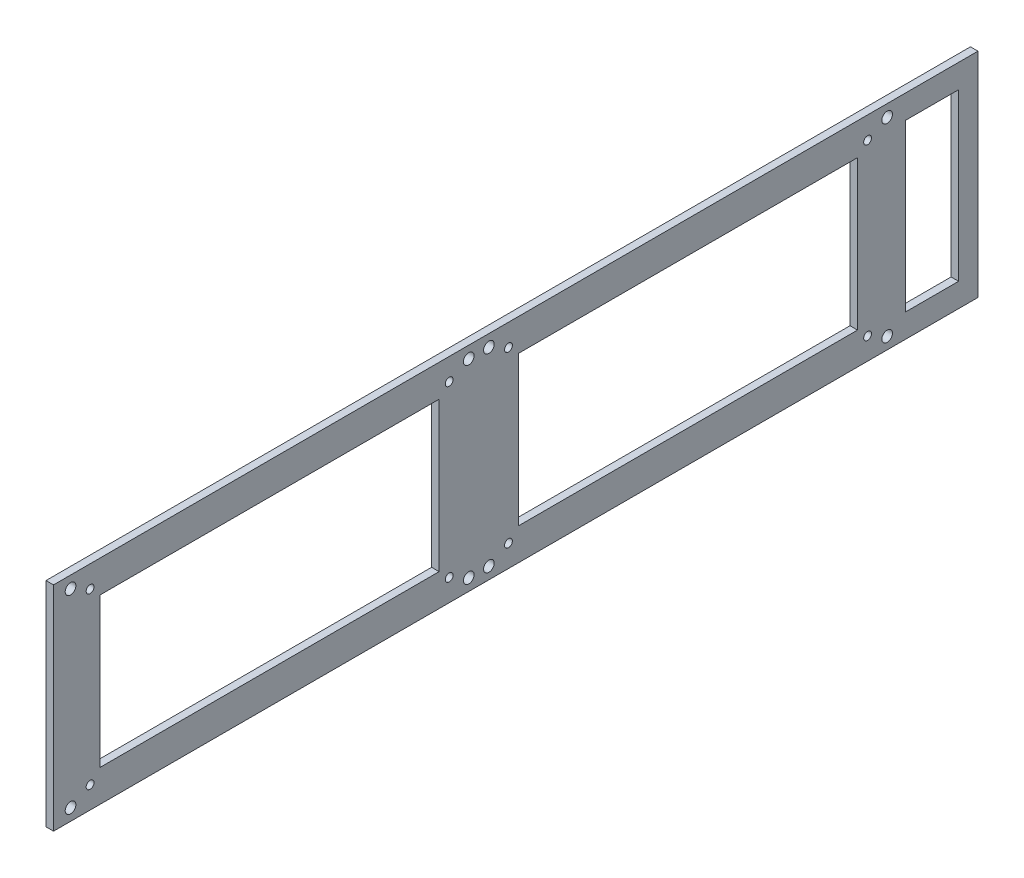
ISO-10303-21;
HEADER;
FILE_DESCRIPTION(('STEP AP214'),'2;1');
FILE_NAME('part.step','',(''),(''),'','','');
FILE_SCHEMA(('AUTOMOTIVE_DESIGN { 1 0 10303 214 1 1 1 1 }'));
ENDSEC;
DATA;
#1=APPLICATION_CONTEXT('core data for automotive mechanical design processes');
#2=APPLICATION_PROTOCOL_DEFINITION('international standard','automotive_design',2000,#1);
#3=PRODUCT_CONTEXT('',#1,'mechanical');
#4=PRODUCT('Part','Part','',(#3));
#5=PRODUCT_RELATED_PRODUCT_CATEGORY('part','',(#4));
#6=PRODUCT_DEFINITION_FORMATION('','',#4);
#7=PRODUCT_DEFINITION_CONTEXT('part definition',#1,'design');
#8=PRODUCT_DEFINITION('design','',#6,#7);
#9=PRODUCT_DEFINITION_SHAPE('','',#8);
#10=(LENGTH_UNIT() NAMED_UNIT(*) SI_UNIT(.MILLI.,.METRE.));
#11=(NAMED_UNIT(*) PLANE_ANGLE_UNIT() SI_UNIT($,.RADIAN.));
#12=(NAMED_UNIT(*) SI_UNIT($,.STERADIAN.) SOLID_ANGLE_UNIT());
#13=UNCERTAINTY_MEASURE_WITH_UNIT(LENGTH_MEASURE(1.E-05),#10,'distance_accuracy_value','');
#14=(GEOMETRIC_REPRESENTATION_CONTEXT(3) GLOBAL_UNCERTAINTY_ASSIGNED_CONTEXT((#13)) GLOBAL_UNIT_ASSIGNED_CONTEXT((#10,
#11,#12)) REPRESENTATION_CONTEXT('',''));
#15=CARTESIAN_POINT('',(0.,0.,0.));
#16=DIRECTION('',(0.,0.,1.));
#17=DIRECTION('',(1.,0.,0.));
#18=AXIS2_PLACEMENT_3D('',#15,#16,#17);
#19=CARTESIAN_POINT('',(0.,0.,0.));
#20=DIRECTION('',(-1.,0.,0.));
#21=DIRECTION('',(0.,0.,1.));
#22=AXIS2_PLACEMENT_3D('',#19,#20,#21);
#23=PLANE('',#22);
#24=CARTESIAN_POINT('',(0.,-40.,19.825));
#25=DIRECTION('',(1.,0.,0.));
#26=DIRECTION('',(0.,0.,-1.));
#27=AXIS2_PLACEMENT_3D('',#24,#25,#26);
#28=CIRCLE('',#27,2.25);
#29=CARTESIAN_POINT('',(0.,-40.,17.575));
#30=VERTEX_POINT('',#29);
#31=EDGE_CURVE('E463',#30,#30,#28,.T.);
#32=ORIENTED_EDGE('',*,*,#31,.T.);
#33=EDGE_LOOP('',(#32));
#34=FACE_BOUND('',#33,.T.);
#35=CARTESIAN_POINT('',(0.,40.,-156.675));
#36=DIRECTION('',(1.,0.,0.));
#37=DIRECTION('',(0.,0.,-1.));
#38=AXIS2_PLACEMENT_3D('',#35,#36,#37);
#39=CIRCLE('',#38,2.25);
#40=CARTESIAN_POINT('',(0.,40.,-158.925));
#41=VERTEX_POINT('',#40);
#42=EDGE_CURVE('E466',#41,#41,#39,.T.);
#43=ORIENTED_EDGE('',*,*,#42,.T.);
#44=EDGE_LOOP('',(#43));
#45=FACE_BOUND('',#44,.T.);
#46=CARTESIAN_POINT('',(0.,-40.,11.325));
#47=DIRECTION('',(1.,0.,0.));
#48=DIRECTION('',(0.,0.,-1.));
#49=AXIS2_PLACEMENT_3D('',#46,#47,#48);
#50=CIRCLE('',#49,2.25);
#51=CARTESIAN_POINT('',(0.,-40.,9.07500000000004));
#52=VERTEX_POINT('',#51);
#53=EDGE_CURVE('E470',#52,#52,#50,.T.);
#54=ORIENTED_EDGE('',*,*,#53,.T.);
#55=EDGE_LOOP('',(#54));
#56=FACE_BOUND('',#55,.T.);
#57=CARTESIAN_POINT('',(0.,40.,11.325));
#58=DIRECTION('',(1.,0.,0.));
#59=DIRECTION('',(0.,0.,-1.));
#60=AXIS2_PLACEMENT_3D('',#57,#58,#59);
#61=CIRCLE('',#60,2.25);
#62=CARTESIAN_POINT('',(0.,40.,9.07500000000004));
#63=VERTEX_POINT('',#62);
#64=EDGE_CURVE('E474',#63,#63,#61,.T.);
#65=ORIENTED_EDGE('',*,*,#64,.T.);
#66=EDGE_LOOP('',(#65));
#67=FACE_BOUND('',#66,.T.);
#68=CARTESIAN_POINT('',(0.,-40.,-156.675));
#69=DIRECTION('',(1.,0.,0.));
#70=DIRECTION('',(0.,0.,-1.));
#71=AXIS2_PLACEMENT_3D('',#68,#69,#70);
#72=CIRCLE('',#71,2.25);
#73=CARTESIAN_POINT('',(0.,-40.,-158.925));
#74=VERTEX_POINT('',#73);
#75=EDGE_CURVE('E172',#74,#74,#72,.T.);
#76=ORIENTED_EDGE('',*,*,#75,.T.);
#77=EDGE_LOOP('',(#76));
#78=FACE_BOUND('',#77,.T.);
#79=DIRECTION('',(0.,1.,0.));
#80=VECTOR('',#79,1.);
#81=CARTESIAN_POINT('',(0.,-35.,-186.825));
#82=LINE('',#81,#80);
#83=CARTESIAN_POINT('',(0.,-35.,-186.825));
#84=VERTEX_POINT('',#83);
#85=CARTESIAN_POINT('',(0.,35.,-186.825));
#86=VERTEX_POINT('',#85);
#87=EDGE_CURVE('E151',#84,#86,#82,.T.);
#88=ORIENTED_EDGE('',*,*,#87,.T.);
#89=DIRECTION('',(0.,0.,1.));
#90=VECTOR('',#89,1.);
#91=CARTESIAN_POINT('',(0.,35.,-164.35));
#92=LINE('',#91,#90);
#93=CARTESIAN_POINT('',(0.,35.,-164.35));
#94=VERTEX_POINT('',#93);
#95=EDGE_CURVE('E160',#86,#94,#92,.T.);
#96=ORIENTED_EDGE('',*,*,#95,.T.);
#97=DIRECTION('',(0.,-1.,0.));
#98=VECTOR('',#97,1.);
#99=CARTESIAN_POINT('',(0.,-35.,-164.35));
#100=LINE('',#99,#98);
#101=CARTESIAN_POINT('',(0.,-35.,-164.35));
#102=VERTEX_POINT('',#101);
#103=EDGE_CURVE('E51',#94,#102,#100,.T.);
#104=ORIENTED_EDGE('',*,*,#103,.T.);
#105=DIRECTION('',(0.,0.,-1.));
#106=VECTOR('',#105,1.);
#107=CARTESIAN_POINT('',(0.,-35.,-164.35));
#108=LINE('',#107,#106);
#109=EDGE_CURVE('E157',#102,#84,#108,.T.);
#110=ORIENTED_EDGE('',*,*,#109,.T.);
#111=EDGE_LOOP('',(#88,#96,#104,#110));
#112=FACE_BOUND('',#111,.T.);
#113=CARTESIAN_POINT('',(0.,35.75,28.0750000000001));
#114=DIRECTION('',(1.,0.,0.));
#115=DIRECTION('',(0.,0.,-1.));
#116=AXIS2_PLACEMENT_3D('',#113,#114,#115);
#117=CIRCLE('',#116,1.65);
#118=CARTESIAN_POINT('',(0.,35.75,26.4250000000001));
#119=VERTEX_POINT('',#118);
#120=EDGE_CURVE('E190',#119,#119,#117,.T.);
#121=ORIENTED_EDGE('',*,*,#120,.T.);
#122=EDGE_LOOP('',(#121));
#123=FACE_BOUND('',#122,.T.);
#124=CARTESIAN_POINT('',(0.,-35.75,179.575));
#125=DIRECTION('',(1.,0.,0.));
#126=DIRECTION('',(0.,0.,-1.));
#127=AXIS2_PLACEMENT_3D('',#124,#125,#126);
#128=CIRCLE('',#127,1.65);
#129=CARTESIAN_POINT('',(0.,-35.75,177.925));
#130=VERTEX_POINT('',#129);
#131=EDGE_CURVE('E196',#130,#130,#128,.T.);
#132=ORIENTED_EDGE('',*,*,#131,.T.);
#133=EDGE_LOOP('',(#132));
#134=FACE_BOUND('',#133,.T.);
#135=CARTESIAN_POINT('',(0.,35.75,179.575));
#136=DIRECTION('',(1.,0.,0.));
#137=DIRECTION('',(0.,0.,-1.));
#138=AXIS2_PLACEMENT_3D('',#135,#136,#137);
#139=CIRCLE('',#138,1.65);
#140=CARTESIAN_POINT('',(0.,35.75,177.925));
#141=VERTEX_POINT('',#140);
#142=EDGE_CURVE('E202',#141,#141,#139,.T.);
#143=ORIENTED_EDGE('',*,*,#142,.T.);
#144=EDGE_LOOP('',(#143));
#145=FACE_BOUND('',#144,.T.);
#146=CARTESIAN_POINT('',(0.,-35.75,28.0750000000001));
#147=DIRECTION('',(1.,0.,0.));
#148=DIRECTION('',(0.,0.,-1.));
#149=AXIS2_PLACEMENT_3D('',#146,#147,#148);
#150=CIRCLE('',#149,1.65);
#151=CARTESIAN_POINT('',(0.,-35.75,26.4250000000001));
#152=VERTEX_POINT('',#151);
#153=EDGE_CURVE('E208',#152,#152,#150,.T.);
#154=ORIENTED_EDGE('',*,*,#153,.T.);
#155=EDGE_LOOP('',(#154));
#156=FACE_BOUND('',#155,.T.);
#157=CARTESIAN_POINT('',(0.,35.75,-148.425));
#158=DIRECTION('',(1.,0.,0.));
#159=DIRECTION('',(0.,0.,-1.));
#160=AXIS2_PLACEMENT_3D('',#157,#158,#159);
#161=CIRCLE('',#160,1.65);
#162=CARTESIAN_POINT('',(0.,35.75,-150.075));
#163=VERTEX_POINT('',#162);
#164=EDGE_CURVE('E214',#163,#163,#161,.T.);
#165=ORIENTED_EDGE('',*,*,#164,.T.);
#166=EDGE_LOOP('',(#165));
#167=FACE_BOUND('',#166,.T.);
#168=CARTESIAN_POINT('',(0.,-35.75,3.07500000000004));
#169=DIRECTION('',(1.,0.,0.));
#170=DIRECTION('',(0.,0.,-1.));
#171=AXIS2_PLACEMENT_3D('',#168,#169,#170);
#172=CIRCLE('',#171,1.65);
#173=CARTESIAN_POINT('',(0.,-35.75,1.42500000000004));
#174=VERTEX_POINT('',#173);
#175=EDGE_CURVE('E220',#174,#174,#172,.T.);
#176=ORIENTED_EDGE('',*,*,#175,.T.);
#177=EDGE_LOOP('',(#176));
#178=FACE_BOUND('',#177,.T.);
#179=CARTESIAN_POINT('',(0.,35.75,3.07500000000004));
#180=DIRECTION('',(1.,0.,0.));
#181=DIRECTION('',(0.,0.,-1.));
#182=AXIS2_PLACEMENT_3D('',#179,#180,#181);
#183=CIRCLE('',#182,1.65);
#184=CARTESIAN_POINT('',(0.,35.75,1.42500000000004));
#185=VERTEX_POINT('',#184);
#186=EDGE_CURVE('E226',#185,#185,#183,.T.);
#187=ORIENTED_EDGE('',*,*,#186,.T.);
#188=EDGE_LOOP('',(#187));
#189=FACE_BOUND('',#188,.T.);
#190=DIRECTION('',(0.,1.,0.));
#191=VECTOR('',#190,1.);
#192=CARTESIAN_POINT('',(0.,-45.,-195.));
#193=LINE('',#192,#191);
#194=CARTESIAN_POINT('',(0.,-45.,-195.));
#195=VERTEX_POINT('',#194);
#196=CARTESIAN_POINT('',(0.,45.,-195.));
#197=VERTEX_POINT('',#196);
#198=EDGE_CURVE('E263',#195,#197,#193,.T.);
#199=ORIENTED_EDGE('',*,*,#198,.F.);
#200=DIRECTION('',(0.,0.,-1.));
#201=VECTOR('',#200,1.);
#202=CARTESIAN_POINT('',(0.,-45.,195.));
#203=LINE('',#202,#201);
#204=CARTESIAN_POINT('',(0.,-45.,195.));
#205=VERTEX_POINT('',#204);
#206=EDGE_CURVE('E304',#205,#195,#203,.T.);
#207=ORIENTED_EDGE('',*,*,#206,.F.);
#208=DIRECTION('',(0.,-1.,0.));
#209=VECTOR('',#208,1.);
#210=CARTESIAN_POINT('',(0.,-45.,195.));
#211=LINE('',#210,#209);
#212=CARTESIAN_POINT('',(0.,45.,195.));
#213=VERTEX_POINT('',#212);
#214=EDGE_CURVE('E315',#213,#205,#211,.T.);
#215=ORIENTED_EDGE('',*,*,#214,.F.);
#216=DIRECTION('',(0.,0.,1.));
#217=VECTOR('',#216,1.);
#218=CARTESIAN_POINT('',(0.,45.,195.));
#219=LINE('',#218,#217);
#220=EDGE_CURVE('E313',#197,#213,#219,.T.);
#221=ORIENTED_EDGE('',*,*,#220,.F.);
#222=EDGE_LOOP('',(#199,#207,#215,#221));
#223=FACE_BOUND('',#222,.T.);
#224=DIRECTION('',(0.,1.,0.));
#225=VECTOR('',#224,1.);
#226=CARTESIAN_POINT('',(0.,-31.5,-144.175));
#227=LINE('',#226,#225);
#228=CARTESIAN_POINT('',(0.,-31.5,-144.175));
#229=VERTEX_POINT('',#228);
#230=CARTESIAN_POINT('',(0.,31.5,-144.175));
#231=VERTEX_POINT('',#230);
#232=EDGE_CURVE('E270',#229,#231,#227,.T.);
#233=ORIENTED_EDGE('',*,*,#232,.T.);
#234=DIRECTION('',(0.,0.,1.));
#235=VECTOR('',#234,1.);
#236=CARTESIAN_POINT('',(0.,31.5,-1.17499999999993));
#237=LINE('',#236,#235);
#238=CARTESIAN_POINT('',(0.,31.5,-1.17499999999993));
#239=VERTEX_POINT('',#238);
#240=EDGE_CURVE('E273',#231,#239,#237,.T.);
#241=ORIENTED_EDGE('',*,*,#240,.T.);
#242=DIRECTION('',(0.,-1.,0.));
#243=VECTOR('',#242,1.);
#244=CARTESIAN_POINT('',(0.,-31.5,-1.17499999999993));
#245=LINE('',#244,#243);
#246=CARTESIAN_POINT('',(0.,-31.5,-1.17499999999993));
#247=VERTEX_POINT('',#246);
#248=EDGE_CURVE('E277',#239,#247,#245,.T.);
#249=ORIENTED_EDGE('',*,*,#248,.T.);
#250=DIRECTION('',(0.,0.,-1.));
#251=VECTOR('',#250,1.);
#252=CARTESIAN_POINT('',(0.,-31.5,-1.17499999999993));
#253=LINE('',#252,#251);
#254=EDGE_CURVE('E280',#247,#229,#253,.T.);
#255=ORIENTED_EDGE('',*,*,#254,.T.);
#256=EDGE_LOOP('',(#233,#241,#249,#255));
#257=FACE_BOUND('',#256,.T.);
#258=DIRECTION('',(0.,1.,0.));
#259=VECTOR('',#258,1.);
#260=CARTESIAN_POINT('',(0.,-31.5,32.325));
#261=LINE('',#260,#259);
#262=CARTESIAN_POINT('',(0.,-31.5,32.325));
#263=VERTEX_POINT('',#262);
#264=CARTESIAN_POINT('',(0.,31.5,32.325));
#265=VERTEX_POINT('',#264);
#266=EDGE_CURVE('E236',#263,#265,#261,.T.);
#267=ORIENTED_EDGE('',*,*,#266,.T.);
#268=DIRECTION('',(0.,0.,1.));
#269=VECTOR('',#268,1.);
#270=CARTESIAN_POINT('',(0.,31.5,175.325));
#271=LINE('',#270,#269);
#272=CARTESIAN_POINT('',(0.,31.5,175.325));
#273=VERTEX_POINT('',#272);
#274=EDGE_CURVE('E239',#265,#273,#271,.T.);
#275=ORIENTED_EDGE('',*,*,#274,.T.);
#276=DIRECTION('',(0.,-1.,0.));
#277=VECTOR('',#276,1.);
#278=CARTESIAN_POINT('',(0.,-31.5,175.325));
#279=LINE('',#278,#277);
#280=CARTESIAN_POINT('',(0.,-31.5,175.325));
#281=VERTEX_POINT('',#280);
#282=EDGE_CURVE('E243',#273,#281,#279,.T.);
#283=ORIENTED_EDGE('',*,*,#282,.T.);
#284=DIRECTION('',(0.,0.,-1.));
#285=VECTOR('',#284,1.);
#286=CARTESIAN_POINT('',(0.,-31.5,175.325));
#287=LINE('',#286,#285);
#288=EDGE_CURVE('E246',#281,#263,#287,.T.);
#289=ORIENTED_EDGE('',*,*,#288,.T.);
#290=EDGE_LOOP('',(#267,#275,#283,#289));
#291=FACE_BOUND('',#290,.T.);
#292=CARTESIAN_POINT('',(0.,-35.75,-148.425));
#293=DIRECTION('',(1.,0.,0.));
#294=DIRECTION('',(0.,0.,-1.));
#295=AXIS2_PLACEMENT_3D('',#292,#293,#294);
#296=CIRCLE('',#295,1.65);
#297=CARTESIAN_POINT('',(0.,-35.75,-150.075));
#298=VERTEX_POINT('',#297);
#299=EDGE_CURVE('E232',#298,#298,#296,.T.);
#300=ORIENTED_EDGE('',*,*,#299,.T.);
#301=EDGE_LOOP('',(#300));
#302=FACE_BOUND('',#301,.T.);
#303=CARTESIAN_POINT('',(0.,40.,187.825));
#304=DIRECTION('',(1.,0.,0.));
#305=DIRECTION('',(0.,0.,-1.));
#306=AXIS2_PLACEMENT_3D('',#303,#304,#305);
#307=CIRCLE('',#306,2.25);
#308=CARTESIAN_POINT('',(0.,40.,185.575));
#309=VERTEX_POINT('',#308);
#310=EDGE_CURVE('E446',#309,#309,#307,.T.);
#311=ORIENTED_EDGE('',*,*,#310,.T.);
#312=EDGE_LOOP('',(#311));
#313=FACE_BOUND('',#312,.T.);
#314=CARTESIAN_POINT('',(0.,-40.,187.825));
#315=DIRECTION('',(1.,0.,0.));
#316=DIRECTION('',(0.,0.,-1.));
#317=AXIS2_PLACEMENT_3D('',#314,#315,#316);
#318=CIRCLE('',#317,2.25);
#319=CARTESIAN_POINT('',(0.,-40.,185.575));
#320=VERTEX_POINT('',#319);
#321=EDGE_CURVE('E450',#320,#320,#318,.T.);
#322=ORIENTED_EDGE('',*,*,#321,.T.);
#323=EDGE_LOOP('',(#322));
#324=FACE_BOUND('',#323,.T.);
#325=CARTESIAN_POINT('',(0.,40.,19.825));
#326=DIRECTION('',(1.,0.,0.));
#327=DIRECTION('',(0.,0.,-1.));
#328=AXIS2_PLACEMENT_3D('',#325,#326,#327);
#329=CIRCLE('',#328,2.25);
#330=CARTESIAN_POINT('',(0.,40.,17.575));
#331=VERTEX_POINT('',#330);
#332=EDGE_CURVE('E453',#331,#331,#329,.T.);
#333=ORIENTED_EDGE('',*,*,#332,.T.);
#334=EDGE_LOOP('',(#333));
#335=FACE_BOUND('',#334,.T.);
#336=ADVANCED_FACE('F36',(#34,#45,#56,#67,#78,#112,#123,#134,#145,#156,#167,#178,#189,#223,#257,
#291,#302,#313,#324,#335),#23,.T.);
#337=CARTESIAN_POINT('',(3.175,-45.,-195.));
#338=DIRECTION('',(0.,0.,1.));
#339=DIRECTION('',(1.,0.,0.));
#340=AXIS2_PLACEMENT_3D('',#337,#338,#339);
#341=PLANE('',#340);
#342=ORIENTED_EDGE('',*,*,#198,.T.);
#343=DIRECTION('',(-1.,0.,0.));
#344=VECTOR('',#343,1.);
#345=CARTESIAN_POINT('',(3.175,45.,-195.));
#346=LINE('',#345,#344);
#347=CARTESIAN_POINT('',(3.175,45.,-195.));
#348=VERTEX_POINT('',#347);
#349=EDGE_CURVE('E11',#348,#197,#346,.T.);
#350=ORIENTED_EDGE('',*,*,#349,.F.);
#351=DIRECTION('',(0.,1.,0.));
#352=VECTOR('',#351,1.);
#353=CARTESIAN_POINT('',(3.175,-45.,-195.));
#354=LINE('',#353,#352);
#355=CARTESIAN_POINT('',(3.175,-45.,-195.));
#356=VERTEX_POINT('',#355);
#357=EDGE_CURVE('E300',#356,#348,#354,.T.);
#358=ORIENTED_EDGE('',*,*,#357,.F.);
#359=DIRECTION('',(-1.,0.,0.));
#360=VECTOR('',#359,1.);
#361=CARTESIAN_POINT('',(3.175,-45.,-195.));
#362=LINE('',#361,#360);
#363=EDGE_CURVE('E310',#356,#195,#362,.T.);
#364=ORIENTED_EDGE('',*,*,#363,.T.);
#365=EDGE_LOOP('',(#342,#350,#358,#364));
#366=FACE_BOUND('',#365,.T.);
#367=ADVANCED_FACE('F38',(#366),#341,.F.);
#368=CARTESIAN_POINT('',(3.175,45.,195.));
#369=DIRECTION('',(0.,-1.,0.));
#370=DIRECTION('',(0.,0.,-1.));
#371=AXIS2_PLACEMENT_3D('',#368,#369,#370);
#372=PLANE('',#371);
#373=ORIENTED_EDGE('',*,*,#220,.T.);
#374=DIRECTION('',(-1.,0.,0.));
#375=VECTOR('',#374,1.);
#376=CARTESIAN_POINT('',(3.175,45.,195.));
#377=LINE('',#376,#375);
#378=CARTESIAN_POINT('',(3.175,45.,195.));
#379=VERTEX_POINT('',#378);
#380=EDGE_CURVE('E44',#379,#213,#377,.T.);
#381=ORIENTED_EDGE('',*,*,#380,.F.);
#382=DIRECTION('',(0.,0.,1.));
#383=VECTOR('',#382,1.);
#384=CARTESIAN_POINT('',(3.175,45.,195.));
#385=LINE('',#384,#383);
#386=EDGE_CURVE('E303',#348,#379,#385,.T.);
#387=ORIENTED_EDGE('',*,*,#386,.F.);
#388=ORIENTED_EDGE('',*,*,#349,.T.);
#389=EDGE_LOOP('',(#373,#381,#387,#388));
#390=FACE_BOUND('',#389,.T.);
#391=ADVANCED_FACE('F343',(#390),#372,.F.);
#392=CARTESIAN_POINT('',(3.175,-45.,195.));
#393=DIRECTION('',(0.,0.,-1.));
#394=DIRECTION('',(-1.,0.,0.));
#395=AXIS2_PLACEMENT_3D('',#392,#393,#394);
#396=PLANE('',#395);
#397=ORIENTED_EDGE('',*,*,#214,.T.);
#398=DIRECTION('',(-1.,0.,0.));
#399=VECTOR('',#398,1.);
#400=CARTESIAN_POINT('',(3.175,-45.,195.));
#401=LINE('',#400,#399);
#402=CARTESIAN_POINT('',(3.175,-45.,195.));
#403=VERTEX_POINT('',#402);
#404=EDGE_CURVE('E320',#403,#205,#401,.T.);
#405=ORIENTED_EDGE('',*,*,#404,.F.);
#406=DIRECTION('',(0.,-1.,0.));
#407=VECTOR('',#406,1.);
#408=CARTESIAN_POINT('',(3.175,-45.,195.));
#409=LINE('',#408,#407);
#410=EDGE_CURVE('E306',#379,#403,#409,.T.);
#411=ORIENTED_EDGE('',*,*,#410,.F.);
#412=ORIENTED_EDGE('',*,*,#380,.T.);
#413=EDGE_LOOP('',(#397,#405,#411,#412));
#414=FACE_BOUND('',#413,.T.);
#415=ADVANCED_FACE('F327',(#414),#396,.F.);
#416=CARTESIAN_POINT('',(3.175,-45.,195.));
#417=DIRECTION('',(0.,1.,0.));
#418=DIRECTION('',(0.,0.,1.));
#419=AXIS2_PLACEMENT_3D('',#416,#417,#418);
#420=PLANE('',#419);
#421=ORIENTED_EDGE('',*,*,#206,.T.);
#422=ORIENTED_EDGE('',*,*,#363,.F.);
#423=DIRECTION('',(0.,0.,-1.));
#424=VECTOR('',#423,1.);
#425=CARTESIAN_POINT('',(3.175,-45.,195.));
#426=LINE('',#425,#424);
#427=EDGE_CURVE('E308',#403,#356,#426,.T.);
#428=ORIENTED_EDGE('',*,*,#427,.F.);
#429=ORIENTED_EDGE('',*,*,#404,.T.);
#430=EDGE_LOOP('',(#421,#422,#428,#429));
#431=FACE_BOUND('',#430,.T.);
#432=ADVANCED_FACE('F336',(#431),#420,.F.);
#433=CARTESIAN_POINT('',(3.175,0.,0.));
#434=DIRECTION('',(-1.,0.,0.));
#435=DIRECTION('',(0.,0.,1.));
#436=AXIS2_PLACEMENT_3D('',#433,#434,#435);
#437=PLANE('',#436);
#438=CARTESIAN_POINT('',(3.175,40.,19.825));
#439=DIRECTION('',(1.,0.,0.));
#440=DIRECTION('',(0.,0.,-1.));
#441=AXIS2_PLACEMENT_3D('',#438,#439,#440);
#442=CIRCLE('',#441,2.24999999999999);
#443=CARTESIAN_POINT('',(3.175,40.,17.575));
#444=VERTEX_POINT('',#443);
#445=EDGE_CURVE('E374',#444,#444,#442,.T.);
#446=ORIENTED_EDGE('',*,*,#445,.F.);
#447=EDGE_LOOP('',(#446));
#448=FACE_BOUND('',#447,.T.);
#449=CARTESIAN_POINT('',(3.175,-40.,187.825));
#450=DIRECTION('',(1.,0.,0.));
#451=DIRECTION('',(0.,0.,-1.));
#452=AXIS2_PLACEMENT_3D('',#449,#450,#451);
#453=CIRCLE('',#452,2.24999999999999);
#454=CARTESIAN_POINT('',(3.175,-40.,185.575));
#455=VERTEX_POINT('',#454);
#456=EDGE_CURVE('E378',#455,#455,#453,.T.);
#457=ORIENTED_EDGE('',*,*,#456,.F.);
#458=EDGE_LOOP('',(#457));
#459=FACE_BOUND('',#458,.T.);
#460=CARTESIAN_POINT('',(3.175,40.,187.825));
#461=DIRECTION('',(1.,0.,0.));
#462=DIRECTION('',(0.,0.,-1.));
#463=AXIS2_PLACEMENT_3D('',#460,#461,#462);
#464=CIRCLE('',#463,2.24999999999999);
#465=CARTESIAN_POINT('',(3.175,40.,185.575));
#466=VERTEX_POINT('',#465);
#467=EDGE_CURVE('E382',#466,#466,#464,.T.);
#468=ORIENTED_EDGE('',*,*,#467,.F.);
#469=EDGE_LOOP('',(#468));
#470=FACE_BOUND('',#469,.T.);
#471=CARTESIAN_POINT('',(3.175,-40.,19.825));
#472=DIRECTION('',(1.,0.,0.));
#473=DIRECTION('',(0.,0.,-1.));
#474=AXIS2_PLACEMENT_3D('',#471,#472,#473);
#475=CIRCLE('',#474,2.24999999999999);
#476=CARTESIAN_POINT('',(3.175,-40.,17.575));
#477=VERTEX_POINT('',#476);
#478=EDGE_CURVE('E386',#477,#477,#475,.T.);
#479=ORIENTED_EDGE('',*,*,#478,.F.);
#480=EDGE_LOOP('',(#479));
#481=FACE_BOUND('',#480,.T.);
#482=CARTESIAN_POINT('',(3.175,40.,-156.675));
#483=DIRECTION('',(1.,0.,0.));
#484=DIRECTION('',(0.,0.,-1.));
#485=AXIS2_PLACEMENT_3D('',#482,#483,#484);
#486=CIRCLE('',#485,2.24999999999999);
#487=CARTESIAN_POINT('',(3.175,40.,-158.925));
#488=VERTEX_POINT('',#487);
#489=EDGE_CURVE('E390',#488,#488,#486,.T.);
#490=ORIENTED_EDGE('',*,*,#489,.F.);
#491=EDGE_LOOP('',(#490));
#492=FACE_BOUND('',#491,.T.);
#493=CARTESIAN_POINT('',(3.175,-40.,11.325));
#494=DIRECTION('',(1.,0.,0.));
#495=DIRECTION('',(0.,0.,-1.));
#496=AXIS2_PLACEMENT_3D('',#493,#494,#495);
#497=CIRCLE('',#496,2.24999999999999);
#498=CARTESIAN_POINT('',(3.175,-40.,9.07500000000005));
#499=VERTEX_POINT('',#498);
#500=EDGE_CURVE('E394',#499,#499,#497,.T.);
#501=ORIENTED_EDGE('',*,*,#500,.F.);
#502=EDGE_LOOP('',(#501));
#503=FACE_BOUND('',#502,.T.);
#504=CARTESIAN_POINT('',(3.175,40.,11.325));
#505=DIRECTION('',(1.,0.,0.));
#506=DIRECTION('',(0.,0.,-1.));
#507=AXIS2_PLACEMENT_3D('',#504,#505,#506);
#508=CIRCLE('',#507,2.24999999999999);
#509=CARTESIAN_POINT('',(3.175,40.,9.07500000000005));
#510=VERTEX_POINT('',#509);
#511=EDGE_CURVE('E398',#510,#510,#508,.T.);
#512=ORIENTED_EDGE('',*,*,#511,.F.);
#513=EDGE_LOOP('',(#512));
#514=FACE_BOUND('',#513,.T.);
#515=CARTESIAN_POINT('',(3.175,-40.,-156.675));
#516=DIRECTION('',(1.,0.,0.));
#517=DIRECTION('',(0.,0.,-1.));
#518=AXIS2_PLACEMENT_3D('',#515,#516,#517);
#519=CIRCLE('',#518,2.24999999999999);
#520=CARTESIAN_POINT('',(3.175,-40.,-158.925));
#521=VERTEX_POINT('',#520);
#522=EDGE_CURVE('E402',#521,#521,#519,.T.);
#523=ORIENTED_EDGE('',*,*,#522,.F.);
#524=EDGE_LOOP('',(#523));
#525=FACE_BOUND('',#524,.T.);
#526=DIRECTION('',(0.,0.,1.));
#527=VECTOR('',#526,1.);
#528=CARTESIAN_POINT('',(3.175,35.,-164.35));
#529=LINE('',#528,#527);
#530=CARTESIAN_POINT('',(3.175,35.,-186.825));
#531=VERTEX_POINT('',#530);
#532=CARTESIAN_POINT('',(3.175,35.,-164.35));
#533=VERTEX_POINT('',#532);
#534=EDGE_CURVE('E178',#531,#533,#529,.T.);
#535=ORIENTED_EDGE('',*,*,#534,.F.);
#536=DIRECTION('',(0.,1.,0.));
#537=VECTOR('',#536,1.);
#538=CARTESIAN_POINT('',(3.175,-35.,-186.825));
#539=LINE('',#538,#537);
#540=CARTESIAN_POINT('',(3.175,-35.,-186.825));
#541=VERTEX_POINT('',#540);
#542=EDGE_CURVE('E59',#541,#531,#539,.T.);
#543=ORIENTED_EDGE('',*,*,#542,.F.);
#544=DIRECTION('',(0.,0.,-1.));
#545=VECTOR('',#544,1.);
#546=CARTESIAN_POINT('',(3.175,-35.,-164.35));
#547=LINE('',#546,#545);
#548=CARTESIAN_POINT('',(3.175,-35.,-164.35));
#549=VERTEX_POINT('',#548);
#550=EDGE_CURVE('E166',#549,#541,#547,.T.);
#551=ORIENTED_EDGE('',*,*,#550,.F.);
#552=DIRECTION('',(0.,-1.,0.));
#553=VECTOR('',#552,1.);
#554=CARTESIAN_POINT('',(3.175,-35.,-164.35));
#555=LINE('',#554,#553);
#556=EDGE_CURVE('E169',#533,#549,#555,.T.);
#557=ORIENTED_EDGE('',*,*,#556,.F.);
#558=EDGE_LOOP('',(#535,#543,#551,#557));
#559=FACE_BOUND('',#558,.T.);
#560=CARTESIAN_POINT('',(3.175,35.75,28.0750000000001));
#561=DIRECTION('',(1.,0.,0.));
#562=DIRECTION('',(0.,0.,-1.));
#563=AXIS2_PLACEMENT_3D('',#560,#561,#562);
#564=CIRCLE('',#563,1.65);
#565=CARTESIAN_POINT('',(3.175,35.75,26.4250000000001));
#566=VERTEX_POINT('',#565);
#567=EDGE_CURVE('E184',#566,#566,#564,.T.);
#568=ORIENTED_EDGE('',*,*,#567,.F.);
#569=EDGE_LOOP('',(#568));
#570=FACE_BOUND('',#569,.T.);
#571=CARTESIAN_POINT('',(3.175,-35.75,179.575));
#572=DIRECTION('',(1.,0.,0.));
#573=DIRECTION('',(0.,0.,-1.));
#574=AXIS2_PLACEMENT_3D('',#571,#572,#573);
#575=CIRCLE('',#574,1.65);
#576=CARTESIAN_POINT('',(3.175,-35.75,177.925));
#577=VERTEX_POINT('',#576);
#578=EDGE_CURVE('E193',#577,#577,#575,.T.);
#579=ORIENTED_EDGE('',*,*,#578,.F.);
#580=EDGE_LOOP('',(#579));
#581=FACE_BOUND('',#580,.T.);
#582=CARTESIAN_POINT('',(3.175,35.75,179.575));
#583=DIRECTION('',(1.,0.,0.));
#584=DIRECTION('',(0.,0.,-1.));
#585=AXIS2_PLACEMENT_3D('',#582,#583,#584);
#586=CIRCLE('',#585,1.65);
#587=CARTESIAN_POINT('',(3.175,35.75,177.925));
#588=VERTEX_POINT('',#587);
#589=EDGE_CURVE('E199',#588,#588,#586,.T.);
#590=ORIENTED_EDGE('',*,*,#589,.F.);
#591=EDGE_LOOP('',(#590));
#592=FACE_BOUND('',#591,.T.);
#593=CARTESIAN_POINT('',(3.175,-35.75,28.0750000000001));
#594=DIRECTION('',(1.,0.,0.));
#595=DIRECTION('',(0.,0.,-1.));
#596=AXIS2_PLACEMENT_3D('',#593,#594,#595);
#597=CIRCLE('',#596,1.65);
#598=CARTESIAN_POINT('',(3.175,-35.75,26.4250000000001));
#599=VERTEX_POINT('',#598);
#600=EDGE_CURVE('E205',#599,#599,#597,.T.);
#601=ORIENTED_EDGE('',*,*,#600,.F.);
#602=EDGE_LOOP('',(#601));
#603=FACE_BOUND('',#602,.T.);
#604=CARTESIAN_POINT('',(3.175,35.75,-148.425));
#605=DIRECTION('',(1.,0.,0.));
#606=DIRECTION('',(0.,0.,-1.));
#607=AXIS2_PLACEMENT_3D('',#604,#605,#606);
#608=CIRCLE('',#607,1.65);
#609=CARTESIAN_POINT('',(3.175,35.75,-150.075));
#610=VERTEX_POINT('',#609);
#611=EDGE_CURVE('E211',#610,#610,#608,.T.);
#612=ORIENTED_EDGE('',*,*,#611,.F.);
#613=EDGE_LOOP('',(#612));
#614=FACE_BOUND('',#613,.T.);
#615=CARTESIAN_POINT('',(3.175,-35.75,3.07500000000004));
#616=DIRECTION('',(1.,0.,0.));
#617=DIRECTION('',(0.,0.,-1.));
#618=AXIS2_PLACEMENT_3D('',#615,#616,#617);
#619=CIRCLE('',#618,1.65);
#620=CARTESIAN_POINT('',(3.175,-35.75,1.42500000000004));
#621=VERTEX_POINT('',#620);
#622=EDGE_CURVE('E217',#621,#621,#619,.T.);
#623=ORIENTED_EDGE('',*,*,#622,.F.);
#624=EDGE_LOOP('',(#623));
#625=FACE_BOUND('',#624,.T.);
#626=CARTESIAN_POINT('',(3.175,35.75,3.07500000000004));
#627=DIRECTION('',(1.,0.,0.));
#628=DIRECTION('',(0.,0.,-1.));
#629=AXIS2_PLACEMENT_3D('',#626,#627,#628);
#630=CIRCLE('',#629,1.65);
#631=CARTESIAN_POINT('',(3.175,35.75,1.42500000000004));
#632=VERTEX_POINT('',#631);
#633=EDGE_CURVE('E223',#632,#632,#630,.T.);
#634=ORIENTED_EDGE('',*,*,#633,.F.);
#635=EDGE_LOOP('',(#634));
#636=FACE_BOUND('',#635,.T.);
#637=CARTESIAN_POINT('',(3.175,-35.75,-148.425));
#638=DIRECTION('',(1.,0.,0.));
#639=DIRECTION('',(0.,0.,-1.));
#640=AXIS2_PLACEMENT_3D('',#637,#638,#639);
#641=CIRCLE('',#640,1.65);
#642=CARTESIAN_POINT('',(3.175,-35.75,-150.075));
#643=VERTEX_POINT('',#642);
#644=EDGE_CURVE('E229',#643,#643,#641,.T.);
#645=ORIENTED_EDGE('',*,*,#644,.F.);
#646=EDGE_LOOP('',(#645));
#647=FACE_BOUND('',#646,.T.);
#648=DIRECTION('',(0.,0.,1.));
#649=VECTOR('',#648,1.);
#650=CARTESIAN_POINT('',(3.175,31.5,175.325));
#651=LINE('',#650,#649);
#652=CARTESIAN_POINT('',(3.175,31.5,32.325));
#653=VERTEX_POINT('',#652);
#654=CARTESIAN_POINT('',(3.175,31.5,175.325));
#655=VERTEX_POINT('',#654);
#656=EDGE_CURVE('E252',#653,#655,#651,.T.);
#657=ORIENTED_EDGE('',*,*,#656,.F.);
#658=DIRECTION('',(0.,1.,0.));
#659=VECTOR('',#658,1.);
#660=CARTESIAN_POINT('',(3.175,-31.5,32.325));
#661=LINE('',#660,#659);
#662=CARTESIAN_POINT('',(3.175,-31.5,32.325));
#663=VERTEX_POINT('',#662);
#664=EDGE_CURVE('E250',#663,#653,#661,.T.);
#665=ORIENTED_EDGE('',*,*,#664,.F.);
#666=DIRECTION('',(0.,0.,-1.));
#667=VECTOR('',#666,1.);
#668=CARTESIAN_POINT('',(3.175,-31.5,175.325));
#669=LINE('',#668,#667);
#670=CARTESIAN_POINT('',(3.175,-31.5,175.325));
#671=VERTEX_POINT('',#670);
#672=EDGE_CURVE('E240',#671,#663,#669,.T.);
#673=ORIENTED_EDGE('',*,*,#672,.F.);
#674=DIRECTION('',(0.,-1.,0.));
#675=VECTOR('',#674,1.);
#676=CARTESIAN_POINT('',(3.175,-31.5,175.325));
#677=LINE('',#676,#675);
#678=EDGE_CURVE('E256',#655,#671,#677,.T.);
#679=ORIENTED_EDGE('',*,*,#678,.F.);
#680=EDGE_LOOP('',(#657,#665,#673,#679));
#681=FACE_BOUND('',#680,.T.);
#682=DIRECTION('',(0.,0.,1.));
#683=VECTOR('',#682,1.);
#684=CARTESIAN_POINT('',(3.175,31.5,-1.17499999999993));
#685=LINE('',#684,#683);
#686=CARTESIAN_POINT('',(3.175,31.5,-144.175));
#687=VERTEX_POINT('',#686);
#688=CARTESIAN_POINT('',(3.175,31.5,-1.17499999999993));
#689=VERTEX_POINT('',#688);
#690=EDGE_CURVE('E285',#687,#689,#685,.T.);
#691=ORIENTED_EDGE('',*,*,#690,.F.);
#692=DIRECTION('',(0.,1.,0.));
#693=VECTOR('',#692,1.);
#694=CARTESIAN_POINT('',(3.175,-31.5,-144.175));
#695=LINE('',#694,#693);
#696=CARTESIAN_POINT('',(3.175,-31.5,-144.175));
#697=VERTEX_POINT('',#696);
#698=EDGE_CURVE('E235',#697,#687,#695,.T.);
#699=ORIENTED_EDGE('',*,*,#698,.F.);
#700=DIRECTION('',(0.,0.,-1.));
#701=VECTOR('',#700,1.);
#702=CARTESIAN_POINT('',(3.175,-31.5,-1.17499999999993));
#703=LINE('',#702,#701);
#704=CARTESIAN_POINT('',(3.175,-31.5,-1.17499999999993));
#705=VERTEX_POINT('',#704);
#706=EDGE_CURVE('E274',#705,#697,#703,.T.);
#707=ORIENTED_EDGE('',*,*,#706,.F.);
#708=DIRECTION('',(0.,-1.,0.));
#709=VECTOR('',#708,1.);
#710=CARTESIAN_POINT('',(3.175,-31.5,-1.17499999999993));
#711=LINE('',#710,#709);
#712=EDGE_CURVE('E288',#689,#705,#711,.T.);
#713=ORIENTED_EDGE('',*,*,#712,.F.);
#714=EDGE_LOOP('',(#691,#699,#707,#713));
#715=FACE_BOUND('',#714,.T.);
#716=ORIENTED_EDGE('',*,*,#357,.T.);
#717=ORIENTED_EDGE('',*,*,#386,.T.);
#718=ORIENTED_EDGE('',*,*,#410,.T.);
#719=ORIENTED_EDGE('',*,*,#427,.T.);
#720=EDGE_LOOP('',(#716,#717,#718,#719));
#721=FACE_BOUND('',#720,.T.);
#722=ADVANCED_FACE('F342',(#448,#459,#470,#481,#492,#503,#514,#525,#559,#570,#581,#592,#603,
#614,#625,#636,#647,#681,#715,#721),#437,.F.);
#723=CARTESIAN_POINT('',(0.,-31.5,-144.175));
#724=DIRECTION('',(0.,0.,-1.));
#725=DIRECTION('',(-1.,0.,0.));
#726=AXIS2_PLACEMENT_3D('',#723,#724,#725);
#727=PLANE('',#726);
#728=ORIENTED_EDGE('',*,*,#698,.T.);
#729=DIRECTION('',(1.,0.,0.));
#730=VECTOR('',#729,1.);
#731=CARTESIAN_POINT('',(0.,31.5,-144.175));
#732=LINE('',#731,#730);
#733=EDGE_CURVE('E283',#231,#687,#732,.T.);
#734=ORIENTED_EDGE('',*,*,#733,.F.);
#735=ORIENTED_EDGE('',*,*,#232,.F.);
#736=DIRECTION('',(1.,0.,0.));
#737=VECTOR('',#736,1.);
#738=CARTESIAN_POINT('',(0.,-31.5,-144.175));
#739=LINE('',#738,#737);
#740=EDGE_CURVE('E253',#229,#697,#739,.T.);
#741=ORIENTED_EDGE('',*,*,#740,.T.);
#742=EDGE_LOOP('',(#728,#734,#735,#741));
#743=FACE_BOUND('',#742,.T.);
#744=ADVANCED_FACE('F364',(#743),#727,.F.);
#745=CARTESIAN_POINT('',(0.,-31.5,-1.17499999999993));
#746=DIRECTION('',(0.,-1.,0.));
#747=DIRECTION('',(0.,0.,-1.));
#748=AXIS2_PLACEMENT_3D('',#745,#746,#747);
#749=PLANE('',#748);
#750=ORIENTED_EDGE('',*,*,#706,.T.);
#751=ORIENTED_EDGE('',*,*,#740,.F.);
#752=ORIENTED_EDGE('',*,*,#254,.F.);
#753=DIRECTION('',(1.,0.,0.));
#754=VECTOR('',#753,1.);
#755=CARTESIAN_POINT('',(0.,-31.5,-1.17499999999993));
#756=LINE('',#755,#754);
#757=EDGE_CURVE('E294',#247,#705,#756,.T.);
#758=ORIENTED_EDGE('',*,*,#757,.T.);
#759=EDGE_LOOP('',(#750,#751,#752,#758));
#760=FACE_BOUND('',#759,.T.);
#761=ADVANCED_FACE('F369',(#760),#749,.F.);
#762=CARTESIAN_POINT('',(0.,-31.5,-1.17499999999993));
#763=DIRECTION('',(0.,0.,1.));
#764=DIRECTION('',(1.,0.,0.));
#765=AXIS2_PLACEMENT_3D('',#762,#763,#764);
#766=PLANE('',#765);
#767=ORIENTED_EDGE('',*,*,#712,.T.);
#768=ORIENTED_EDGE('',*,*,#757,.F.);
#769=ORIENTED_EDGE('',*,*,#248,.F.);
#770=DIRECTION('',(1.,0.,0.));
#771=VECTOR('',#770,1.);
#772=CARTESIAN_POINT('',(0.,31.5,-1.17499999999993));
#773=LINE('',#772,#771);
#774=EDGE_CURVE('E296',#239,#689,#773,.T.);
#775=ORIENTED_EDGE('',*,*,#774,.T.);
#776=EDGE_LOOP('',(#767,#768,#769,#775));
#777=FACE_BOUND('',#776,.T.);
#778=ADVANCED_FACE('F437',(#777),#766,.F.);
#779=CARTESIAN_POINT('',(0.,31.5,-1.17499999999993));
#780=DIRECTION('',(0.,1.,0.));
#781=DIRECTION('',(0.,0.,1.));
#782=AXIS2_PLACEMENT_3D('',#779,#780,#781);
#783=PLANE('',#782);
#784=ORIENTED_EDGE('',*,*,#690,.T.);
#785=ORIENTED_EDGE('',*,*,#774,.F.);
#786=ORIENTED_EDGE('',*,*,#240,.F.);
#787=ORIENTED_EDGE('',*,*,#733,.T.);
#788=EDGE_LOOP('',(#784,#785,#786,#787));
#789=FACE_BOUND('',#788,.T.);
#790=ADVANCED_FACE('F431',(#789),#783,.F.);
#791=CARTESIAN_POINT('',(0.,-31.5,32.325));
#792=DIRECTION('',(0.,0.,-1.));
#793=DIRECTION('',(-1.,0.,0.));
#794=AXIS2_PLACEMENT_3D('',#791,#792,#793);
#795=PLANE('',#794);
#796=ORIENTED_EDGE('',*,*,#664,.T.);
#797=DIRECTION('',(1.,0.,0.));
#798=VECTOR('',#797,1.);
#799=CARTESIAN_POINT('',(0.,31.5,32.325));
#800=LINE('',#799,#798);
#801=EDGE_CURVE('E249',#265,#653,#800,.T.);
#802=ORIENTED_EDGE('',*,*,#801,.F.);
#803=ORIENTED_EDGE('',*,*,#266,.F.);
#804=DIRECTION('',(1.,0.,0.));
#805=VECTOR('',#804,1.);
#806=CARTESIAN_POINT('',(0.,-31.5,32.325));
#807=LINE('',#806,#805);
#808=EDGE_CURVE('E261',#263,#663,#807,.T.);
#809=ORIENTED_EDGE('',*,*,#808,.T.);
#810=EDGE_LOOP('',(#796,#802,#803,#809));
#811=FACE_BOUND('',#810,.T.);
#812=ADVANCED_FACE('F541',(#811),#795,.F.);
#813=CARTESIAN_POINT('',(0.,-31.5,175.325));
#814=DIRECTION('',(0.,-1.,0.));
#815=DIRECTION('',(0.,0.,-1.));
#816=AXIS2_PLACEMENT_3D('',#813,#814,#815);
#817=PLANE('',#816);
#818=ORIENTED_EDGE('',*,*,#672,.T.);
#819=ORIENTED_EDGE('',*,*,#808,.F.);
#820=ORIENTED_EDGE('',*,*,#288,.F.);
#821=DIRECTION('',(1.,0.,0.));
#822=VECTOR('',#821,1.);
#823=CARTESIAN_POINT('',(0.,-31.5,175.325));
#824=LINE('',#823,#822);
#825=EDGE_CURVE('E264',#281,#671,#824,.T.);
#826=ORIENTED_EDGE('',*,*,#825,.T.);
#827=EDGE_LOOP('',(#818,#819,#820,#826));
#828=FACE_BOUND('',#827,.T.);
#829=ADVANCED_FACE('F537',(#828),#817,.F.);
#830=CARTESIAN_POINT('',(0.,-31.5,175.325));
#831=DIRECTION('',(0.,0.,1.));
#832=DIRECTION('',(1.,0.,0.));
#833=AXIS2_PLACEMENT_3D('',#830,#831,#832);
#834=PLANE('',#833);
#835=ORIENTED_EDGE('',*,*,#678,.T.);
#836=ORIENTED_EDGE('',*,*,#825,.F.);
#837=ORIENTED_EDGE('',*,*,#282,.F.);
#838=DIRECTION('',(1.,0.,0.));
#839=VECTOR('',#838,1.);
#840=CARTESIAN_POINT('',(0.,31.5,175.325));
#841=LINE('',#840,#839);
#842=EDGE_CURVE('E266',#273,#655,#841,.T.);
#843=ORIENTED_EDGE('',*,*,#842,.T.);
#844=EDGE_LOOP('',(#835,#836,#837,#843));
#845=FACE_BOUND('',#844,.T.);
#846=ADVANCED_FACE('F540',(#845),#834,.F.);
#847=CARTESIAN_POINT('',(0.,31.5,175.325));
#848=DIRECTION('',(0.,1.,0.));
#849=DIRECTION('',(0.,0.,1.));
#850=AXIS2_PLACEMENT_3D('',#847,#848,#849);
#851=PLANE('',#850);
#852=ORIENTED_EDGE('',*,*,#656,.T.);
#853=ORIENTED_EDGE('',*,*,#842,.F.);
#854=ORIENTED_EDGE('',*,*,#274,.F.);
#855=ORIENTED_EDGE('',*,*,#801,.T.);
#856=EDGE_LOOP('',(#852,#853,#854,#855));
#857=FACE_BOUND('',#856,.T.);
#858=ADVANCED_FACE('F535',(#857),#851,.F.);
#859=CARTESIAN_POINT('',(3.175,-35.75,-148.425));
#860=DIRECTION('',(1.,0.,0.));
#861=DIRECTION('',(0.,0.,-1.));
#862=AXIS2_PLACEMENT_3D('',#859,#860,#861);
#863=CYLINDRICAL_SURFACE('',#862,1.65);
#864=ORIENTED_EDGE('',*,*,#299,.F.);
#865=EDGE_LOOP('',(#864));
#866=FACE_BOUND('',#865,.T.);
#867=ORIENTED_EDGE('',*,*,#644,.T.);
#868=EDGE_LOOP('',(#867));
#869=FACE_BOUND('',#868,.T.);
#870=ADVANCED_FACE('F531',(#866,#869),#863,.F.);
#871=CARTESIAN_POINT('',(3.175,35.75,3.07500000000004));
#872=DIRECTION('',(1.,0.,0.));
#873=DIRECTION('',(0.,0.,-1.));
#874=AXIS2_PLACEMENT_3D('',#871,#872,#873);
#875=CYLINDRICAL_SURFACE('',#874,1.65);
#876=ORIENTED_EDGE('',*,*,#186,.F.);
#877=EDGE_LOOP('',(#876));
#878=FACE_BOUND('',#877,.T.);
#879=ORIENTED_EDGE('',*,*,#633,.T.);
#880=EDGE_LOOP('',(#879));
#881=FACE_BOUND('',#880,.T.);
#882=ADVANCED_FACE('F527',(#878,#881),#875,.F.);
#883=CARTESIAN_POINT('',(3.175,-35.75,3.07500000000004));
#884=DIRECTION('',(1.,0.,0.));
#885=DIRECTION('',(0.,0.,-1.));
#886=AXIS2_PLACEMENT_3D('',#883,#884,#885);
#887=CYLINDRICAL_SURFACE('',#886,1.65);
#888=ORIENTED_EDGE('',*,*,#175,.F.);
#889=EDGE_LOOP('',(#888));
#890=FACE_BOUND('',#889,.T.);
#891=ORIENTED_EDGE('',*,*,#622,.T.);
#892=EDGE_LOOP('',(#891));
#893=FACE_BOUND('',#892,.T.);
#894=ADVANCED_FACE('F523',(#890,#893),#887,.F.);
#895=CARTESIAN_POINT('',(3.175,35.75,-148.425));
#896=DIRECTION('',(1.,0.,0.));
#897=DIRECTION('',(0.,0.,-1.));
#898=AXIS2_PLACEMENT_3D('',#895,#896,#897);
#899=CYLINDRICAL_SURFACE('',#898,1.65);
#900=ORIENTED_EDGE('',*,*,#164,.F.);
#901=EDGE_LOOP('',(#900));
#902=FACE_BOUND('',#901,.T.);
#903=ORIENTED_EDGE('',*,*,#611,.T.);
#904=EDGE_LOOP('',(#903));
#905=FACE_BOUND('',#904,.T.);
#906=ADVANCED_FACE('F519',(#902,#905),#899,.F.);
#907=CARTESIAN_POINT('',(3.175,-35.75,28.0750000000001));
#908=DIRECTION('',(1.,0.,0.));
#909=DIRECTION('',(0.,0.,-1.));
#910=AXIS2_PLACEMENT_3D('',#907,#908,#909);
#911=CYLINDRICAL_SURFACE('',#910,1.65);
#912=ORIENTED_EDGE('',*,*,#153,.F.);
#913=EDGE_LOOP('',(#912));
#914=FACE_BOUND('',#913,.T.);
#915=ORIENTED_EDGE('',*,*,#600,.T.);
#916=EDGE_LOOP('',(#915));
#917=FACE_BOUND('',#916,.T.);
#918=ADVANCED_FACE('F515',(#914,#917),#911,.F.);
#919=CARTESIAN_POINT('',(3.175,35.75,179.575));
#920=DIRECTION('',(1.,0.,0.));
#921=DIRECTION('',(0.,0.,-1.));
#922=AXIS2_PLACEMENT_3D('',#919,#920,#921);
#923=CYLINDRICAL_SURFACE('',#922,1.65);
#924=ORIENTED_EDGE('',*,*,#142,.F.);
#925=EDGE_LOOP('',(#924));
#926=FACE_BOUND('',#925,.T.);
#927=ORIENTED_EDGE('',*,*,#589,.T.);
#928=EDGE_LOOP('',(#927));
#929=FACE_BOUND('',#928,.T.);
#930=ADVANCED_FACE('F511',(#926,#929),#923,.F.);
#931=CARTESIAN_POINT('',(3.175,-35.75,179.575));
#932=DIRECTION('',(1.,0.,0.));
#933=DIRECTION('',(0.,0.,-1.));
#934=AXIS2_PLACEMENT_3D('',#931,#932,#933);
#935=CYLINDRICAL_SURFACE('',#934,1.65);
#936=ORIENTED_EDGE('',*,*,#131,.F.);
#937=EDGE_LOOP('',(#936));
#938=FACE_BOUND('',#937,.T.);
#939=ORIENTED_EDGE('',*,*,#578,.T.);
#940=EDGE_LOOP('',(#939));
#941=FACE_BOUND('',#940,.T.);
#942=ADVANCED_FACE('F507',(#938,#941),#935,.F.);
#943=CARTESIAN_POINT('',(3.175,35.75,28.0750000000001));
#944=DIRECTION('',(1.,0.,0.));
#945=DIRECTION('',(0.,0.,-1.));
#946=AXIS2_PLACEMENT_3D('',#943,#944,#945);
#947=CYLINDRICAL_SURFACE('',#946,1.65);
#948=ORIENTED_EDGE('',*,*,#120,.F.);
#949=EDGE_LOOP('',(#948));
#950=FACE_BOUND('',#949,.T.);
#951=ORIENTED_EDGE('',*,*,#567,.T.);
#952=EDGE_LOOP('',(#951));
#953=FACE_BOUND('',#952,.T.);
#954=ADVANCED_FACE('F504',(#950,#953),#947,.F.);
#955=CARTESIAN_POINT('',(0.,-35.,-186.825));
#956=DIRECTION('',(0.,0.,-1.));
#957=DIRECTION('',(-1.,0.,0.));
#958=AXIS2_PLACEMENT_3D('',#955,#956,#957);
#959=PLANE('',#958);
#960=ORIENTED_EDGE('',*,*,#542,.T.);
#961=DIRECTION('',(1.,0.,0.));
#962=VECTOR('',#961,1.);
#963=CARTESIAN_POINT('',(0.,35.,-186.825));
#964=LINE('',#963,#962);
#965=EDGE_CURVE('E147',#86,#531,#964,.T.);
#966=ORIENTED_EDGE('',*,*,#965,.F.);
#967=ORIENTED_EDGE('',*,*,#87,.F.);
#968=DIRECTION('',(1.,0.,0.));
#969=VECTOR('',#968,1.);
#970=CARTESIAN_POINT('',(0.,-35.,-186.825));
#971=LINE('',#970,#969);
#972=EDGE_CURVE('E182',#84,#541,#971,.T.);
#973=ORIENTED_EDGE('',*,*,#972,.T.);
#974=EDGE_LOOP('',(#960,#966,#967,#973));
#975=FACE_BOUND('',#974,.T.);
#976=ADVANCED_FACE('F149',(#975),#959,.F.);
#977=CARTESIAN_POINT('',(0.,-35.,-164.35));
#978=DIRECTION('',(0.,-1.,0.));
#979=DIRECTION('',(0.,0.,-1.));
#980=AXIS2_PLACEMENT_3D('',#977,#978,#979);
#981=PLANE('',#980);
#982=ORIENTED_EDGE('',*,*,#550,.T.);
#983=ORIENTED_EDGE('',*,*,#972,.F.);
#984=ORIENTED_EDGE('',*,*,#109,.F.);
#985=DIRECTION('',(1.,0.,0.));
#986=VECTOR('',#985,1.);
#987=CARTESIAN_POINT('',(0.,-35.,-164.35));
#988=LINE('',#987,#986);
#989=EDGE_CURVE('E185',#102,#549,#988,.T.);
#990=ORIENTED_EDGE('',*,*,#989,.T.);
#991=EDGE_LOOP('',(#982,#983,#984,#990));
#992=FACE_BOUND('',#991,.T.);
#993=ADVANCED_FACE('F496',(#992),#981,.F.);
#994=CARTESIAN_POINT('',(0.,-35.,-164.35));
#995=DIRECTION('',(0.,0.,1.));
#996=DIRECTION('',(1.,0.,0.));
#997=AXIS2_PLACEMENT_3D('',#994,#995,#996);
#998=PLANE('',#997);
#999=ORIENTED_EDGE('',*,*,#556,.T.);
#1000=ORIENTED_EDGE('',*,*,#989,.F.);
#1001=ORIENTED_EDGE('',*,*,#103,.F.);
#1002=DIRECTION('',(1.,0.,0.));
#1003=VECTOR('',#1002,1.);
#1004=CARTESIAN_POINT('',(0.,35.,-164.35));
#1005=LINE('',#1004,#1003);
#1006=EDGE_CURVE('E156',#94,#533,#1005,.T.);
#1007=ORIENTED_EDGE('',*,*,#1006,.T.);
#1008=EDGE_LOOP('',(#999,#1000,#1001,#1007));
#1009=FACE_BOUND('',#1008,.T.);
#1010=ADVANCED_FACE('F492',(#1009),#998,.F.);
#1011=CARTESIAN_POINT('',(0.,35.,-164.35));
#1012=DIRECTION('',(0.,1.,0.));
#1013=DIRECTION('',(0.,0.,1.));
#1014=AXIS2_PLACEMENT_3D('',#1011,#1012,#1013);
#1015=PLANE('',#1014);
#1016=ORIENTED_EDGE('',*,*,#534,.T.);
#1017=ORIENTED_EDGE('',*,*,#1006,.F.);
#1018=ORIENTED_EDGE('',*,*,#95,.F.);
#1019=ORIENTED_EDGE('',*,*,#965,.T.);
#1020=EDGE_LOOP('',(#1016,#1017,#1018,#1019));
#1021=FACE_BOUND('',#1020,.T.);
#1022=ADVANCED_FACE('F161',(#1021),#1015,.F.);
#1023=CARTESIAN_POINT('',(3.175,-40.,-156.675));
#1024=DIRECTION('',(1.,0.,0.));
#1025=DIRECTION('',(0.,0.,-1.));
#1026=AXIS2_PLACEMENT_3D('',#1023,#1024,#1025);
#1027=CYLINDRICAL_SURFACE('',#1026,2.25);
#1028=ORIENTED_EDGE('',*,*,#75,.F.);
#1029=EDGE_LOOP('',(#1028));
#1030=FACE_BOUND('',#1029,.T.);
#1031=ORIENTED_EDGE('',*,*,#522,.T.);
#1032=EDGE_LOOP('',(#1031));
#1033=FACE_BOUND('',#1032,.T.);
#1034=ADVANCED_FACE('F481',(#1030,#1033),#1027,.F.);
#1035=CARTESIAN_POINT('',(3.175,40.,11.325));
#1036=DIRECTION('',(1.,0.,0.));
#1037=DIRECTION('',(0.,0.,-1.));
#1038=AXIS2_PLACEMENT_3D('',#1035,#1036,#1037);
#1039=CYLINDRICAL_SURFACE('',#1038,2.25);
#1040=ORIENTED_EDGE('',*,*,#64,.F.);
#1041=EDGE_LOOP('',(#1040));
#1042=FACE_BOUND('',#1041,.T.);
#1043=ORIENTED_EDGE('',*,*,#511,.T.);
#1044=EDGE_LOOP('',(#1043));
#1045=FACE_BOUND('',#1044,.T.);
#1046=ADVANCED_FACE('F483',(#1042,#1045),#1039,.F.);
#1047=CARTESIAN_POINT('',(3.175,-40.,11.325));
#1048=DIRECTION('',(1.,0.,0.));
#1049=DIRECTION('',(0.,0.,-1.));
#1050=AXIS2_PLACEMENT_3D('',#1047,#1048,#1049);
#1051=CYLINDRICAL_SURFACE('',#1050,2.25);
#1052=ORIENTED_EDGE('',*,*,#53,.F.);
#1053=EDGE_LOOP('',(#1052));
#1054=FACE_BOUND('',#1053,.T.);
#1055=ORIENTED_EDGE('',*,*,#500,.T.);
#1056=EDGE_LOOP('',(#1055));
#1057=FACE_BOUND('',#1056,.T.);
#1058=ADVANCED_FACE('F489',(#1054,#1057),#1051,.F.);
#1059=CARTESIAN_POINT('',(3.175,40.,-156.675));
#1060=DIRECTION('',(1.,0.,0.));
#1061=DIRECTION('',(0.,0.,-1.));
#1062=AXIS2_PLACEMENT_3D('',#1059,#1060,#1061);
#1063=CYLINDRICAL_SURFACE('',#1062,2.25);
#1064=ORIENTED_EDGE('',*,*,#42,.F.);
#1065=EDGE_LOOP('',(#1064));
#1066=FACE_BOUND('',#1065,.T.);
#1067=ORIENTED_EDGE('',*,*,#489,.T.);
#1068=EDGE_LOOP('',(#1067));
#1069=FACE_BOUND('',#1068,.T.);
#1070=ADVANCED_FACE('F654',(#1066,#1069),#1063,.F.);
#1071=CARTESIAN_POINT('',(3.175,-40.,19.825));
#1072=DIRECTION('',(1.,0.,0.));
#1073=DIRECTION('',(0.,0.,-1.));
#1074=AXIS2_PLACEMENT_3D('',#1071,#1072,#1073);
#1075=CYLINDRICAL_SURFACE('',#1074,2.25);
#1076=ORIENTED_EDGE('',*,*,#31,.F.);
#1077=EDGE_LOOP('',(#1076));
#1078=FACE_BOUND('',#1077,.T.);
#1079=ORIENTED_EDGE('',*,*,#478,.T.);
#1080=EDGE_LOOP('',(#1079));
#1081=FACE_BOUND('',#1080,.T.);
#1082=ADVANCED_FACE('F663',(#1078,#1081),#1075,.F.);
#1083=CARTESIAN_POINT('',(3.175,40.,187.825));
#1084=DIRECTION('',(1.,0.,0.));
#1085=DIRECTION('',(0.,0.,-1.));
#1086=AXIS2_PLACEMENT_3D('',#1083,#1084,#1085);
#1087=CYLINDRICAL_SURFACE('',#1086,2.25);
#1088=ORIENTED_EDGE('',*,*,#310,.F.);
#1089=EDGE_LOOP('',(#1088));
#1090=FACE_BOUND('',#1089,.T.);
#1091=ORIENTED_EDGE('',*,*,#467,.T.);
#1092=EDGE_LOOP('',(#1091));
#1093=FACE_BOUND('',#1092,.T.);
#1094=ADVANCED_FACE('F673',(#1090,#1093),#1087,.F.);
#1095=CARTESIAN_POINT('',(3.175,-40.,187.825));
#1096=DIRECTION('',(1.,0.,0.));
#1097=DIRECTION('',(0.,0.,-1.));
#1098=AXIS2_PLACEMENT_3D('',#1095,#1096,#1097);
#1099=CYLINDRICAL_SURFACE('',#1098,2.25);
#1100=ORIENTED_EDGE('',*,*,#321,.F.);
#1101=EDGE_LOOP('',(#1100));
#1102=FACE_BOUND('',#1101,.T.);
#1103=ORIENTED_EDGE('',*,*,#456,.T.);
#1104=EDGE_LOOP('',(#1103));
#1105=FACE_BOUND('',#1104,.T.);
#1106=ADVANCED_FACE('F683',(#1102,#1105),#1099,.F.);
#1107=CARTESIAN_POINT('',(3.175,40.,19.825));
#1108=DIRECTION('',(1.,0.,0.));
#1109=DIRECTION('',(0.,0.,-1.));
#1110=AXIS2_PLACEMENT_3D('',#1107,#1108,#1109);
#1111=CYLINDRICAL_SURFACE('',#1110,2.25);
#1112=ORIENTED_EDGE('',*,*,#332,.F.);
#1113=EDGE_LOOP('',(#1112));
#1114=FACE_BOUND('',#1113,.T.);
#1115=ORIENTED_EDGE('',*,*,#445,.T.);
#1116=EDGE_LOOP('',(#1115));
#1117=FACE_BOUND('',#1116,.T.);
#1118=ADVANCED_FACE('F693',(#1114,#1117),#1111,.F.);
#1119=CLOSED_SHELL('',(#336,#367,#391,#415,#432,#722,#744,#761,#778,#790,#812,#829,#846,#858,
#870,#882,#894,#906,#918,#930,#942,#954,#976,#993,#1010,#1022,#1034,#1046,#1058,#1070,#1082,
#1094,#1106,#1118));
#1120=MANIFOLD_SOLID_BREP('B2',#1119);
#1121=ADVANCED_BREP_SHAPE_REPRESENTATION('',(#18,#1120),#14);
#1122=SHAPE_DEFINITION_REPRESENTATION(#9,#1121);
ENDSEC;
END-ISO-10303-21;
